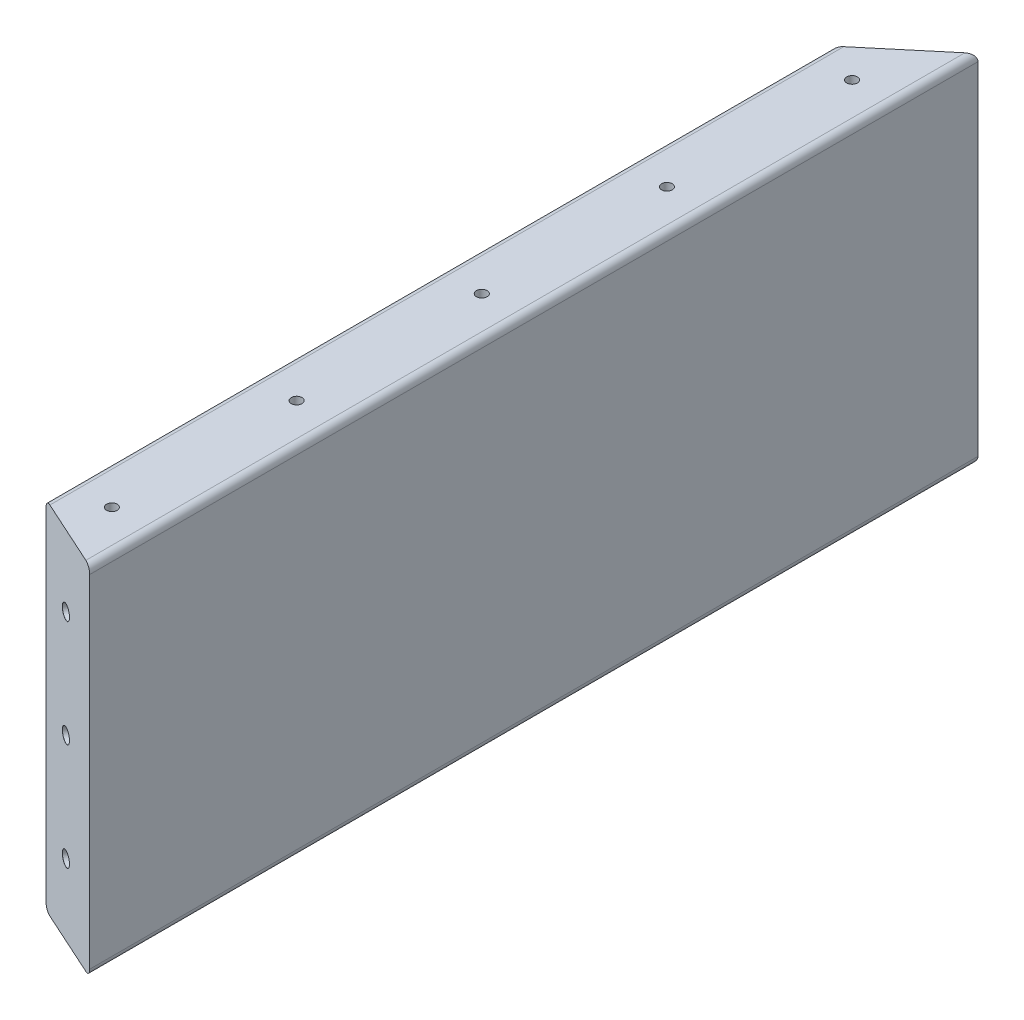
ISO-10303-21;
HEADER;
FILE_DESCRIPTION(('STEP AP214'),'2;1');
FILE_NAME('part.step','',(''),(''),'','','');
FILE_SCHEMA(('AUTOMOTIVE_DESIGN { 1 0 10303 214 1 1 1 1 }'));
ENDSEC;
DATA;
#1=APPLICATION_CONTEXT('core data for automotive mechanical design processes');
#2=APPLICATION_PROTOCOL_DEFINITION('international standard','automotive_design',2000,#1);
#3=PRODUCT_CONTEXT('',#1,'mechanical');
#4=PRODUCT('Part','Part','',(#3));
#5=PRODUCT_RELATED_PRODUCT_CATEGORY('part','',(#4));
#6=PRODUCT_DEFINITION_FORMATION('','',#4);
#7=PRODUCT_DEFINITION_CONTEXT('part definition',#1,'design');
#8=PRODUCT_DEFINITION('design','',#6,#7);
#9=PRODUCT_DEFINITION_SHAPE('','',#8);
#10=(LENGTH_UNIT() NAMED_UNIT(*) SI_UNIT(.MILLI.,.METRE.));
#11=(NAMED_UNIT(*) PLANE_ANGLE_UNIT() SI_UNIT($,.RADIAN.));
#12=(NAMED_UNIT(*) SI_UNIT($,.STERADIAN.) SOLID_ANGLE_UNIT());
#13=UNCERTAINTY_MEASURE_WITH_UNIT(LENGTH_MEASURE(1.E-05),#10,'distance_accuracy_value','');
#14=(GEOMETRIC_REPRESENTATION_CONTEXT(3) GLOBAL_UNCERTAINTY_ASSIGNED_CONTEXT((#13)) GLOBAL_UNIT_ASSIGNED_CONTEXT((#10,
#11,#12)) REPRESENTATION_CONTEXT('',''));
#15=CARTESIAN_POINT('',(0.,0.,0.));
#16=DIRECTION('',(0.,0.,1.));
#17=DIRECTION('',(1.,0.,0.));
#18=AXIS2_PLACEMENT_3D('',#15,#16,#17);
#19=CARTESIAN_POINT('',(13.8117445887715,134.272684877163,500.));
#20=DIRECTION('',(-1.,0.,0.));
#21=DIRECTION('',(0.,0.,1.));
#22=AXIS2_PLACEMENT_3D('',#19,#20,#21);
#23=PLANE('',#22);
#24=DIRECTION('',(0.,-1.,0.));
#25=VECTOR('',#24,1.);
#26=CARTESIAN_POINT('',(13.8117445887714,814.76440392337,1.02723667248411));
#27=LINE('',#26,#25);
#28=CARTESIAN_POINT('',(13.8117445887715,130.272684877163,1.02723667248412));
#29=VERTEX_POINT('',#28);
#30=CARTESIAN_POINT('',(13.8117445887715,-61.7273151228369,1.02723667248412));
#31=VERTEX_POINT('',#30);
#32=EDGE_CURVE('E233',#29,#31,#27,.T.);
#33=ORIENTED_EDGE('',*,*,#32,.F.);
#34=DIRECTION('',(0.,0.,-1.));
#35=VECTOR('',#34,1.);
#36=CARTESIAN_POINT('',(13.8117445887715,130.272684877163,500.));
#37=LINE('',#36,#35);
#38=CARTESIAN_POINT('',(13.8117445887715,130.272684877163,500.));
#39=VERTEX_POINT('',#38);
#40=EDGE_CURVE('E280',#29,#39,#37,.F.);
#41=ORIENTED_EDGE('',*,*,#40,.T.);
#42=DIRECTION('',(0.,1.,0.));
#43=VECTOR('',#42,1.);
#44=CARTESIAN_POINT('',(13.8117445887715,134.272684877163,500.));
#45=LINE('',#44,#43);
#46=CARTESIAN_POINT('',(13.8117445887715,-61.7273151228369,500.));
#47=VERTEX_POINT('',#46);
#48=EDGE_CURVE('E268',#47,#39,#45,.T.);
#49=ORIENTED_EDGE('',*,*,#48,.F.);
#50=DIRECTION('',(0.,0.,-1.));
#51=VECTOR('',#50,1.);
#52=CARTESIAN_POINT('',(13.8117445887715,-61.7273151228369,500.));
#53=LINE('',#52,#51);
#54=EDGE_CURVE('E282',#47,#31,#53,.T.);
#55=ORIENTED_EDGE('',*,*,#54,.T.);
#56=EDGE_LOOP('',(#33,#41,#49,#55));
#57=FACE_BOUND('',#56,.T.);
#58=ADVANCED_FACE('F32',(#57),#23,.F.);
#59=CARTESIAN_POINT('',(-31.1882554112285,134.272684877163,500.));
#60=DIRECTION('',(0.,-1.,0.));
#61=DIRECTION('',(0.,0.,-1.));
#62=AXIS2_PLACEMENT_3D('',#59,#60,#61);
#63=PLANE('',#62);
#64=CARTESIAN_POINT('',(-8.68825541122808,134.272684877163,49.2763141009438));
#65=DIRECTION('',(0.,-1.,0.));
#66=DIRECTION('',(0.,0.,-1.));
#67=AXIS2_PLACEMENT_3D('',#64,#65,#66);
#68=CIRCLE('',#67,2.99999999999999);
#69=CARTESIAN_POINT('',(-8.68825541122808,134.272684877163,46.2763141009438));
#70=VERTEX_POINT('',#69);
#71=EDGE_CURVE('E177',#70,#70,#68,.T.);
#72=ORIENTED_EDGE('',*,*,#71,.T.);
#73=EDGE_LOOP('',(#72));
#74=FACE_BOUND('',#73,.T.);
#75=CARTESIAN_POINT('',(-8.68825541122831,134.272684877163,465.074922814898));
#76=DIRECTION('',(0.,-1.,0.));
#77=DIRECTION('',(0.,0.,-1.));
#78=AXIS2_PLACEMENT_3D('',#75,#76,#77);
#79=CIRCLE('',#78,2.99999999999999);
#80=CARTESIAN_POINT('',(-8.68825541122831,134.272684877163,462.074922814898));
#81=VERTEX_POINT('',#80);
#82=EDGE_CURVE('E181',#81,#81,#79,.T.);
#83=ORIENTED_EDGE('',*,*,#82,.T.);
#84=EDGE_LOOP('',(#83));
#85=FACE_BOUND('',#84,.T.);
#86=CARTESIAN_POINT('',(-8.68825541122797,134.272684877163,153.276314100944));
#87=DIRECTION('',(0.,-1.,0.));
#88=DIRECTION('',(0.,0.,-1.));
#89=AXIS2_PLACEMENT_3D('',#86,#87,#88);
#90=CIRCLE('',#89,2.99999999999999);
#91=CARTESIAN_POINT('',(-8.68825541122797,134.272684877163,150.276314100944));
#92=VERTEX_POINT('',#91);
#93=EDGE_CURVE('E185',#92,#92,#90,.T.);
#94=ORIENTED_EDGE('',*,*,#93,.T.);
#95=EDGE_LOOP('',(#94));
#96=FACE_BOUND('',#95,.T.);
#97=CARTESIAN_POINT('',(-8.68825541122797,134.272684877163,257.276314100944));
#98=DIRECTION('',(0.,-1.,0.));
#99=DIRECTION('',(0.,0.,-1.));
#100=AXIS2_PLACEMENT_3D('',#97,#98,#99);
#101=CIRCLE('',#100,2.99999999999999);
#102=CARTESIAN_POINT('',(-8.68825541122797,134.272684877163,254.276314100944));
#103=VERTEX_POINT('',#102);
#104=EDGE_CURVE('E189',#103,#103,#101,.T.);
#105=ORIENTED_EDGE('',*,*,#104,.T.);
#106=EDGE_LOOP('',(#105));
#107=FACE_BOUND('',#106,.T.);
#108=CARTESIAN_POINT('',(-8.68825541122797,134.272684877163,361.276314100944));
#109=DIRECTION('',(0.,-1.,0.));
#110=DIRECTION('',(0.,0.,-1.));
#111=AXIS2_PLACEMENT_3D('',#108,#109,#110);
#112=CIRCLE('',#111,2.99999999999999);
#113=CARTESIAN_POINT('',(-8.68825541122797,134.272684877163,358.276314100944));
#114=VERTEX_POINT('',#113);
#115=EDGE_CURVE('E193',#114,#114,#112,.T.);
#116=ORIENTED_EDGE('',*,*,#115,.T.);
#117=EDGE_LOOP('',(#116));
#118=FACE_BOUND('',#117,.T.);
#119=DIRECTION('',(0.766068203582477,0.,-0.642759292005893));
#120=VECTOR('',#119,1.);
#121=CARTESIAN_POINT('',(-258.289896932573,134.272684877163,229.330483876858));
#122=LINE('',#121,#120);
#123=CARTESIAN_POINT('',(-27.1882554112286,134.272684877163,35.4277389371684));
#124=VERTEX_POINT('',#123);
#125=CARTESIAN_POINT('',(9.81174458877147,134.272684877163,4.38338323489235));
#126=VERTEX_POINT('',#125);
#127=EDGE_CURVE('E49',#124,#126,#122,.T.);
#128=ORIENTED_EDGE('',*,*,#127,.F.);
#129=DIRECTION('',(0.,0.,-1.));
#130=VECTOR('',#129,1.);
#131=CARTESIAN_POINT('',(-27.1882554112285,134.272684877163,500.));
#132=LINE('',#131,#130);
#133=CARTESIAN_POINT('',(-27.1882554112285,134.272684877163,481.386216801086));
#134=VERTEX_POINT('',#133);
#135=EDGE_CURVE('E41',#124,#134,#132,.F.);
#136=ORIENTED_EDGE('',*,*,#135,.T.);
#137=DIRECTION('',(0.910555296814359,0.,0.413387289890866));
#138=VECTOR('',#137,1.);
#139=CARTESIAN_POINT('',(-23.4982480962794,134.272684877163,483.061460609936));
#140=LINE('',#139,#138);
#141=CARTESIAN_POINT('',(9.81174458877147,134.272684877163,498.184021151325));
#142=VERTEX_POINT('',#141);
#143=EDGE_CURVE('E255',#134,#142,#140,.T.);
#144=ORIENTED_EDGE('',*,*,#143,.T.);
#145=DIRECTION('',(0.,0.,-1.));
#146=VECTOR('',#145,1.);
#147=CARTESIAN_POINT('',(9.81174458877147,134.272684877163,500.));
#148=LINE('',#147,#146);
#149=EDGE_CURVE('E285',#142,#126,#148,.T.);
#150=ORIENTED_EDGE('',*,*,#149,.T.);
#151=EDGE_LOOP('',(#128,#136,#144,#150));
#152=FACE_BOUND('',#151,.T.);
#153=ADVANCED_FACE('F333',(#74,#85,#96,#107,#118,#152),#63,.F.);
#154=CARTESIAN_POINT('',(-31.1882554112285,-65.7273151228369,500.));
#155=DIRECTION('',(0.,1.,0.));
#156=DIRECTION('',(0.,0.,1.));
#157=AXIS2_PLACEMENT_3D('',#154,#155,#156);
#158=PLANE('',#157);
#159=CARTESIAN_POINT('',(-8.68825541122786,-65.7273151228369,49.2763141009441));
#160=DIRECTION('',(0.,1.,0.));
#161=DIRECTION('',(0.,0.,1.));
#162=AXIS2_PLACEMENT_3D('',#159,#160,#161);
#163=CIRCLE('',#162,2.99999999999999);
#164=CARTESIAN_POINT('',(-8.68825541122786,-65.7273151228369,52.2763141009441));
#165=VERTEX_POINT('',#164);
#166=EDGE_CURVE('E36',#165,#165,#163,.T.);
#167=ORIENTED_EDGE('',*,*,#166,.T.);
#168=EDGE_LOOP('',(#167));
#169=FACE_BOUND('',#168,.T.);
#170=CARTESIAN_POINT('',(-8.68825541122808,-65.7273151228369,465.074922814898));
#171=DIRECTION('',(0.,1.,0.));
#172=DIRECTION('',(0.,0.,1.));
#173=AXIS2_PLACEMENT_3D('',#170,#171,#172);
#174=CIRCLE('',#173,2.99999999999999);
#175=CARTESIAN_POINT('',(-8.68825541122808,-65.7273151228369,468.074922814898));
#176=VERTEX_POINT('',#175);
#177=EDGE_CURVE('E161',#176,#176,#174,.T.);
#178=ORIENTED_EDGE('',*,*,#177,.T.);
#179=EDGE_LOOP('',(#178));
#180=FACE_BOUND('',#179,.T.);
#181=CARTESIAN_POINT('',(-8.68825541122775,-65.7273151228369,153.276314100944));
#182=DIRECTION('',(0.,1.,0.));
#183=DIRECTION('',(0.,0.,1.));
#184=AXIS2_PLACEMENT_3D('',#181,#182,#183);
#185=CIRCLE('',#184,2.99999999999999);
#186=CARTESIAN_POINT('',(-8.68825541122775,-65.7273151228369,156.276314100944));
#187=VERTEX_POINT('',#186);
#188=EDGE_CURVE('E165',#187,#187,#185,.T.);
#189=ORIENTED_EDGE('',*,*,#188,.T.);
#190=EDGE_LOOP('',(#189));
#191=FACE_BOUND('',#190,.T.);
#192=CARTESIAN_POINT('',(-8.68825541122775,-65.7273151228369,257.276314100944));
#193=DIRECTION('',(0.,1.,0.));
#194=DIRECTION('',(0.,0.,1.));
#195=AXIS2_PLACEMENT_3D('',#192,#193,#194);
#196=CIRCLE('',#195,2.99999999999999);
#197=CARTESIAN_POINT('',(-8.68825541122775,-65.7273151228369,260.276314100944));
#198=VERTEX_POINT('',#197);
#199=EDGE_CURVE('E169',#198,#198,#196,.T.);
#200=ORIENTED_EDGE('',*,*,#199,.T.);
#201=EDGE_LOOP('',(#200));
#202=FACE_BOUND('',#201,.T.);
#203=CARTESIAN_POINT('',(-8.68825541122775,-65.7273151228369,361.276314100944));
#204=DIRECTION('',(0.,1.,0.));
#205=DIRECTION('',(0.,0.,1.));
#206=AXIS2_PLACEMENT_3D('',#203,#204,#205);
#207=CIRCLE('',#206,2.99999999999999);
#208=CARTESIAN_POINT('',(-8.68825541122775,-65.7273151228369,364.276314100944));
#209=VERTEX_POINT('',#208);
#210=EDGE_CURVE('E173',#209,#209,#207,.T.);
#211=ORIENTED_EDGE('',*,*,#210,.T.);
#212=EDGE_LOOP('',(#211));
#213=FACE_BOUND('',#212,.T.);
#214=DIRECTION('',(-0.766068203582477,0.,0.642759292005893));
#215=VECTOR('',#214,1.);
#216=CARTESIAN_POINT('',(-258.289896932573,-65.7273151228369,229.330483876858));
#217=LINE('',#216,#215);
#218=CARTESIAN_POINT('',(9.81174458877147,-65.7273151228369,4.38338323489235));
#219=VERTEX_POINT('',#218);
#220=CARTESIAN_POINT('',(-27.1882554112285,-65.7273151228369,35.4277389371684));
#221=VERTEX_POINT('',#220);
#222=EDGE_CURVE('E244',#219,#221,#217,.T.);
#223=ORIENTED_EDGE('',*,*,#222,.F.);
#224=DIRECTION('',(0.,0.,-1.));
#225=VECTOR('',#224,1.);
#226=CARTESIAN_POINT('',(9.81174458877147,-65.7273151228369,500.));
#227=LINE('',#226,#225);
#228=CARTESIAN_POINT('',(9.81174458877147,-65.7273151228369,498.184021151325));
#229=VERTEX_POINT('',#228);
#230=EDGE_CURVE('E271',#219,#229,#227,.F.);
#231=ORIENTED_EDGE('',*,*,#230,.T.);
#232=DIRECTION('',(-0.910555296814359,0.,-0.413387289890866));
#233=VECTOR('',#232,1.);
#234=CARTESIAN_POINT('',(-23.4982480962793,-65.7273151228369,483.061460609936));
#235=LINE('',#234,#233);
#236=CARTESIAN_POINT('',(-27.1882554112285,-65.7273151228369,481.386216801086));
#237=VERTEX_POINT('',#236);
#238=EDGE_CURVE('E57',#229,#237,#235,.T.);
#239=ORIENTED_EDGE('',*,*,#238,.T.);
#240=DIRECTION('',(0.,0.,-1.));
#241=VECTOR('',#240,1.);
#242=CARTESIAN_POINT('',(-27.1882554112285,-65.7273151228369,500.));
#243=LINE('',#242,#241);
#244=EDGE_CURVE('E273',#237,#221,#243,.T.);
#245=ORIENTED_EDGE('',*,*,#244,.T.);
#246=EDGE_LOOP('',(#223,#231,#239,#245));
#247=FACE_BOUND('',#246,.T.);
#248=ADVANCED_FACE('F313',(#169,#180,#191,#202,#213,#247),#158,.F.);
#249=CARTESIAN_POINT('',(-27.1882554112285,-61.7273151228369,500.));
#250=DIRECTION('',(0.,0.,-1.));
#251=DIRECTION('',(-1.,0.,0.));
#252=AXIS2_PLACEMENT_3D('',#249,#250,#251);
#253=CYLINDRICAL_SURFACE('',#252,4.);
#254=DIRECTION('',(0.,0.,-1.));
#255=VECTOR('',#254,1.);
#256=CARTESIAN_POINT('',(-31.1882554112285,-61.7273151228369,500.));
#257=LINE('',#256,#255);
#258=CARTESIAN_POINT('',(-31.1882554112285,-61.7273151228369,38.7838854995766));
#259=VERTEX_POINT('',#258);
#260=CARTESIAN_POINT('',(-31.1882554112285,-61.7273151228369,479.570237952411));
#261=VERTEX_POINT('',#260);
#262=EDGE_CURVE('E278',#259,#261,#257,.F.);
#263=ORIENTED_EDGE('',*,*,#262,.F.);
#264=CARTESIAN_POINT('',(-27.1882554112285,-61.7273151228369,35.4277389371684));
#265=DIRECTION('',(-0.642759292005893,0.,-0.766068203582477));
#266=DIRECTION('',(0.766068203582477,0.,-0.642759292005893));
#267=AXIS2_PLACEMENT_3D('',#264,#265,#266);
#268=ELLIPSE('',#267,5.22146720265143,4.);
#269=EDGE_CURVE('E246',#259,#221,#268,.F.);
#270=ORIENTED_EDGE('',*,*,#269,.T.);
#271=ORIENTED_EDGE('',*,*,#244,.F.);
#272=CARTESIAN_POINT('',(-27.1882554112285,-61.7273151228369,481.386216801086));
#273=DIRECTION('',(0.413387289890866,0.,-0.910555296814359));
#274=DIRECTION('',(-0.910555296814359,0.,-0.413387289890866));
#275=AXIS2_PLACEMENT_3D('',#272,#273,#274);
#276=ELLIPSE('',#275,4.39292376201015,4.);
#277=EDGE_CURVE('E265',#261,#237,#276,.F.);
#278=ORIENTED_EDGE('',*,*,#277,.F.);
#279=EDGE_LOOP('',(#263,#270,#271,#278));
#280=FACE_BOUND('',#279,.T.);
#281=ADVANCED_FACE('F349',(#280),#253,.T.);
#282=CARTESIAN_POINT('',(9.81174458877148,-61.7273151228369,500.));
#283=DIRECTION('',(0.,0.,-1.));
#284=DIRECTION('',(-1.,0.,0.));
#285=AXIS2_PLACEMENT_3D('',#282,#283,#284);
#286=CYLINDRICAL_SURFACE('',#285,4.);
#287=ORIENTED_EDGE('',*,*,#230,.F.);
#288=CARTESIAN_POINT('',(9.81174458877148,-61.7273151228369,4.38338323489235));
#289=DIRECTION('',(-0.642759292005893,0.,-0.766068203582477));
#290=DIRECTION('',(0.766068203582477,0.,-0.642759292005893));
#291=AXIS2_PLACEMENT_3D('',#288,#289,#290);
#292=ELLIPSE('',#291,5.22146720265143,4.);
#293=EDGE_CURVE('E241',#219,#31,#292,.F.);
#294=ORIENTED_EDGE('',*,*,#293,.T.);
#295=ORIENTED_EDGE('',*,*,#54,.F.);
#296=CARTESIAN_POINT('',(9.81174458877148,-61.7273151228369,498.184021151325));
#297=DIRECTION('',(0.413387289890866,0.,-0.910555296814359));
#298=DIRECTION('',(-0.910555296814359,0.,-0.413387289890866));
#299=AXIS2_PLACEMENT_3D('',#296,#297,#298);
#300=ELLIPSE('',#299,4.39292376201015,4.);
#301=EDGE_CURVE('E261',#229,#47,#300,.F.);
#302=ORIENTED_EDGE('',*,*,#301,.F.);
#303=EDGE_LOOP('',(#287,#294,#295,#302));
#304=FACE_BOUND('',#303,.T.);
#305=ADVANCED_FACE('F357',(#304),#286,.T.);
#306=CARTESIAN_POINT('',(-27.1882554112285,130.272684877163,500.));
#307=DIRECTION('',(0.,0.,-1.));
#308=DIRECTION('',(-1.,0.,0.));
#309=AXIS2_PLACEMENT_3D('',#306,#307,#308);
#310=CYLINDRICAL_SURFACE('',#309,4.);
#311=ORIENTED_EDGE('',*,*,#135,.F.);
#312=CARTESIAN_POINT('',(-27.1882554112285,130.272684877163,35.4277389371684));
#313=DIRECTION('',(-0.642759292005893,0.,-0.766068203582477));
#314=DIRECTION('',(0.766068203582477,0.,-0.642759292005893));
#315=AXIS2_PLACEMENT_3D('',#312,#313,#314);
#316=ELLIPSE('',#315,5.22146720265143,4.);
#317=CARTESIAN_POINT('',(-31.1882554112285,130.272684877163,38.7838854995766));
#318=VERTEX_POINT('',#317);
#319=EDGE_CURVE('E238',#124,#318,#316,.F.);
#320=ORIENTED_EDGE('',*,*,#319,.T.);
#321=DIRECTION('',(0.,0.,-1.));
#322=VECTOR('',#321,1.);
#323=CARTESIAN_POINT('',(-31.1882554112285,130.272684877163,500.));
#324=LINE('',#323,#322);
#325=CARTESIAN_POINT('',(-31.1882554112285,130.272684877163,479.570237952411));
#326=VERTEX_POINT('',#325);
#327=EDGE_CURVE('E275',#326,#318,#324,.T.);
#328=ORIENTED_EDGE('',*,*,#327,.F.);
#329=CARTESIAN_POINT('',(-27.1882554112285,130.272684877163,481.386216801086));
#330=DIRECTION('',(0.413387289890866,0.,-0.910555296814359));
#331=DIRECTION('',(-0.910555296814359,0.,-0.413387289890866));
#332=AXIS2_PLACEMENT_3D('',#329,#330,#331);
#333=ELLIPSE('',#332,4.39292376201015,4.);
#334=EDGE_CURVE('E258',#134,#326,#333,.F.);
#335=ORIENTED_EDGE('',*,*,#334,.F.);
#336=EDGE_LOOP('',(#311,#320,#328,#335));
#337=FACE_BOUND('',#336,.T.);
#338=ADVANCED_FACE('F360',(#337),#310,.T.);
#339=CARTESIAN_POINT('',(9.81174458877147,130.272684877163,500.));
#340=DIRECTION('',(0.,0.,-1.));
#341=DIRECTION('',(-1.,0.,0.));
#342=AXIS2_PLACEMENT_3D('',#339,#340,#341);
#343=CYLINDRICAL_SURFACE('',#342,4.);
#344=ORIENTED_EDGE('',*,*,#40,.F.);
#345=CARTESIAN_POINT('',(9.81174458877147,130.272684877163,4.38338323489235));
#346=DIRECTION('',(-0.642759292005893,0.,-0.766068203582477));
#347=DIRECTION('',(0.766068203582477,0.,-0.642759292005893));
#348=AXIS2_PLACEMENT_3D('',#345,#346,#347);
#349=ELLIPSE('',#348,5.22146720265143,4.);
#350=EDGE_CURVE('E235',#29,#126,#349,.F.);
#351=ORIENTED_EDGE('',*,*,#350,.T.);
#352=ORIENTED_EDGE('',*,*,#149,.F.);
#353=CARTESIAN_POINT('',(9.81174458877147,130.272684877163,498.184021151325));
#354=DIRECTION('',(0.413387289890866,0.,-0.910555296814359));
#355=DIRECTION('',(-0.910555296814359,0.,-0.413387289890866));
#356=AXIS2_PLACEMENT_3D('',#353,#354,#355);
#357=ELLIPSE('',#356,4.39292376201015,4.);
#358=EDGE_CURVE('E11',#39,#142,#357,.F.);
#359=ORIENTED_EDGE('',*,*,#358,.F.);
#360=EDGE_LOOP('',(#344,#351,#352,#359));
#361=FACE_BOUND('',#360,.T.);
#362=ADVANCED_FACE('F34',(#361),#343,.T.);
#363=CARTESIAN_POINT('',(-31.1882554112285,134.272684877163,500.));
#364=DIRECTION('',(1.,0.,0.));
#365=DIRECTION('',(0.,1.,0.));
#366=AXIS2_PLACEMENT_3D('',#363,#364,#365);
#367=PLANE('',#366);
#368=ORIENTED_EDGE('',*,*,#327,.T.);
#369=DIRECTION('',(0.,-1.,0.));
#370=VECTOR('',#369,1.);
#371=CARTESIAN_POINT('',(-31.1882554112285,814.76440392337,38.7838854995766));
#372=LINE('',#371,#370);
#373=EDGE_CURVE('E249',#318,#259,#372,.T.);
#374=ORIENTED_EDGE('',*,*,#373,.T.);
#375=ORIENTED_EDGE('',*,*,#262,.T.);
#376=DIRECTION('',(0.,-1.,0.));
#377=VECTOR('',#376,1.);
#378=CARTESIAN_POINT('',(-31.1882554112285,809.76440392337,479.570237952411));
#379=LINE('',#378,#377);
#380=EDGE_CURVE('E252',#326,#261,#379,.T.);
#381=ORIENTED_EDGE('',*,*,#380,.F.);
#382=EDGE_LOOP('',(#368,#374,#375,#381));
#383=FACE_BOUND('',#382,.T.);
#384=ADVANCED_FACE('F351',(#383),#367,.F.);
#385=CARTESIAN_POINT('',(-31.1882554112285,809.76440392337,479.570237952411));
#386=DIRECTION('',(0.413387289890866,0.,-0.910555296814359));
#387=DIRECTION('',(-0.910555296814359,0.,-0.413387289890866));
#388=AXIS2_PLACEMENT_3D('',#385,#386,#387);
#389=PLANE('',#388);
#390=CARTESIAN_POINT('',(-10.7007612329055,94.2726848771631,488.871451974956));
#391=DIRECTION('',(-0.413387289890866,0.,0.910555296814359));
#392=DIRECTION('',(0.910555296814359,0.,0.413387289890866));
#393=AXIS2_PLACEMENT_3D('',#390,#391,#392);
#394=CIRCLE('',#393,4.025);
#395=CARTESIAN_POINT('',(-7.03577616322771,94.2726848771631,490.535335816766));
#396=VERTEX_POINT('',#395);
#397=EDGE_CURVE('E194',#396,#396,#394,.T.);
#398=ORIENTED_EDGE('',*,*,#397,.F.);
#399=EDGE_LOOP('',(#398));
#400=FACE_BOUND('',#399,.T.);
#401=CARTESIAN_POINT('',(-10.7007612329055,34.2726848771631,488.871451974956));
#402=DIRECTION('',(-0.413387289890866,0.,0.910555296814359));
#403=DIRECTION('',(0.910555296814359,0.,0.413387289890866));
#404=AXIS2_PLACEMENT_3D('',#401,#402,#403);
#405=CIRCLE('',#404,4.025);
#406=CARTESIAN_POINT('',(-7.03577616322771,34.2726848771631,490.535335816766));
#407=VERTEX_POINT('',#406);
#408=EDGE_CURVE('E203',#407,#407,#405,.T.);
#409=ORIENTED_EDGE('',*,*,#408,.F.);
#410=EDGE_LOOP('',(#409));
#411=FACE_BOUND('',#410,.T.);
#412=CARTESIAN_POINT('',(-10.7007612329055,-25.7273151228369,488.871451974956));
#413=DIRECTION('',(-0.413387289890866,0.,0.910555296814359));
#414=DIRECTION('',(0.910555296814359,0.,0.413387289890866));
#415=AXIS2_PLACEMENT_3D('',#412,#413,#414);
#416=CIRCLE('',#415,4.025);
#417=CARTESIAN_POINT('',(-7.03577616322771,-25.7273151228369,490.535335816766));
#418=VERTEX_POINT('',#417);
#419=EDGE_CURVE('E212',#418,#418,#416,.T.);
#420=ORIENTED_EDGE('',*,*,#419,.F.);
#421=EDGE_LOOP('',(#420));
#422=FACE_BOUND('',#421,.T.);
#423=ORIENTED_EDGE('',*,*,#380,.T.);
#424=ORIENTED_EDGE('',*,*,#277,.T.);
#425=ORIENTED_EDGE('',*,*,#238,.F.);
#426=ORIENTED_EDGE('',*,*,#301,.T.);
#427=ORIENTED_EDGE('',*,*,#48,.T.);
#428=ORIENTED_EDGE('',*,*,#358,.T.);
#429=ORIENTED_EDGE('',*,*,#143,.F.);
#430=ORIENTED_EDGE('',*,*,#334,.T.);
#431=EDGE_LOOP('',(#423,#424,#425,#426,#427,#428,#429,#430));
#432=FACE_BOUND('',#431,.T.);
#433=ADVANCED_FACE('F345',(#400,#411,#422,#432),#389,.F.);
#434=CARTESIAN_POINT('',(-31.1882554112285,814.76440392337,38.7838854995766));
#435=DIRECTION('',(-0.642759292005893,0.,-0.766068203582477));
#436=DIRECTION('',(-0.766068203582477,0.,0.642759292005893));
#437=AXIS2_PLACEMENT_3D('',#434,#435,#436);
#438=PLANE('',#437);
#439=CARTESIAN_POINT('',(-8.52255726556561,-25.7273151228489,19.7665342705393));
#440=DIRECTION('',(-0.642759292005893,0.,-0.766068203582477));
#441=DIRECTION('',(0.766068203582477,0.,-0.642759292005893));
#442=AXIS2_PLACEMENT_3D('',#439,#440,#441);
#443=ELLIPSE('',#442,3.91584152565515,2.99999999999999);
#444=CARTESIAN_POINT('',(-5.5227555824933,-25.7273151228489,17.249590743902));
#445=VERTEX_POINT('',#444);
#446=EDGE_CURVE('E224',#445,#445,#443,.T.);
#447=ORIENTED_EDGE('',*,*,#446,.F.);
#448=EDGE_LOOP('',(#447));
#449=FACE_BOUND('',#448,.T.);
#450=CARTESIAN_POINT('',(-8.52255726556561,34.2726848771511,19.7665342705394));
#451=DIRECTION('',(-0.642759292005893,0.,-0.766068203582477));
#452=DIRECTION('',(0.766068203582477,0.,-0.642759292005893));
#453=AXIS2_PLACEMENT_3D('',#450,#451,#452);
#454=ELLIPSE('',#453,3.91584152565515,2.99999999999999);
#455=CARTESIAN_POINT('',(-5.5227555824933,34.2726848771511,17.249590743902));
#456=VERTEX_POINT('',#455);
#457=EDGE_CURVE('E228',#456,#456,#454,.T.);
#458=ORIENTED_EDGE('',*,*,#457,.F.);
#459=EDGE_LOOP('',(#458));
#460=FACE_BOUND('',#459,.T.);
#461=CARTESIAN_POINT('',(-8.52255726556561,94.2726848771511,19.7665342705393));
#462=DIRECTION('',(-0.642759292005893,0.,-0.766068203582477));
#463=DIRECTION('',(0.766068203582477,0.,-0.642759292005893));
#464=AXIS2_PLACEMENT_3D('',#461,#462,#463);
#465=ELLIPSE('',#464,3.91584152565515,2.99999999999998);
#466=CARTESIAN_POINT('',(-5.5227555824933,94.2726848771511,17.249590743902));
#467=VERTEX_POINT('',#466);
#468=EDGE_CURVE('E232',#467,#467,#465,.T.);
#469=ORIENTED_EDGE('',*,*,#468,.F.);
#470=EDGE_LOOP('',(#469));
#471=FACE_BOUND('',#470,.T.);
#472=ORIENTED_EDGE('',*,*,#269,.F.);
#473=ORIENTED_EDGE('',*,*,#373,.F.);
#474=ORIENTED_EDGE('',*,*,#319,.F.);
#475=ORIENTED_EDGE('',*,*,#127,.T.);
#476=ORIENTED_EDGE('',*,*,#350,.F.);
#477=ORIENTED_EDGE('',*,*,#32,.T.);
#478=ORIENTED_EDGE('',*,*,#293,.F.);
#479=ORIENTED_EDGE('',*,*,#222,.T.);
#480=EDGE_LOOP('',(#472,#473,#474,#475,#476,#477,#478,#479));
#481=FACE_BOUND('',#480,.T.);
#482=ADVANCED_FACE('F375',(#449,#460,#471,#481),#438,.T.);
#483=CARTESIAN_POINT('',(-8.51923368004279,94.2726848771511,61.9459101549118));
#484=DIRECTION('',(-7.87964601849687E-05,0.,-0.999999996895559));
#485=DIRECTION('',(-0.999999996895559,0.,7.87964601849687E-05));
#486=AXIS2_PLACEMENT_3D('',#483,#484,#485);
#487=CONICAL_SURFACE('',#486,2.99999999999998,1.02974425867663);
#488=CARTESIAN_POINT('',(-8.51909164297326,94.2726848771511,63.7484920063984));
#489=VERTEX_POINT('',#488);
#490=VERTEX_LOOP('',#489);
#491=FACE_BOUND('',#490,.T.);
#492=CARTESIAN_POINT('',(-8.51923368004279,94.2726848771511,61.9459101549118));
#493=DIRECTION('',(-7.87964601849687E-05,0.,-0.999999996895559));
#494=DIRECTION('',(-0.999999996895559,0.,7.87964601849687E-05));
#495=AXIS2_PLACEMENT_3D('',#492,#493,#494);
#496=CIRCLE('',#495,2.99999999999998);
#497=CARTESIAN_POINT('',(-11.5192336707294,94.2726848771511,61.9461465442923));
#498=VERTEX_POINT('',#497);
#499=EDGE_CURVE('E229',#498,#498,#496,.T.);
#500=ORIENTED_EDGE('',*,*,#499,.T.);
#501=EDGE_LOOP('',(#500));
#502=FACE_BOUND('',#501,.T.);
#503=ADVANCED_FACE('F390',(#491,#502),#487,.F.);
#504=CARTESIAN_POINT('',(-8.5293351827973,94.2726848771511,-66.2515075900242));
#505=DIRECTION('',(-7.87964601849687E-05,0.,-0.999999996895559));
#506=DIRECTION('',(-0.999999996895559,0.,7.87964601849687E-05));
#507=AXIS2_PLACEMENT_3D('',#504,#505,#506);
#508=CYLINDRICAL_SURFACE('',#507,2.99999999999998);
#509=ORIENTED_EDGE('',*,*,#468,.T.);
#510=EDGE_LOOP('',(#509));
#511=FACE_BOUND('',#510,.T.);
#512=ORIENTED_EDGE('',*,*,#499,.F.);
#513=EDGE_LOOP('',(#512));
#514=FACE_BOUND('',#513,.T.);
#515=ADVANCED_FACE('F435',(#511,#514),#508,.F.);
#516=CARTESIAN_POINT('',(-8.51923368004279,34.2726848771511,61.9459101549124));
#517=DIRECTION('',(-7.87964601849687E-05,0.,-0.999999996895559));
#518=DIRECTION('',(-0.999999996895559,0.,7.87964601849687E-05));
#519=AXIS2_PLACEMENT_3D('',#516,#517,#518);
#520=CONICAL_SURFACE('',#519,2.99999999999998,1.02974425867663);
#521=CARTESIAN_POINT('',(-8.51909164297326,34.2726848771511,63.748492006399));
#522=VERTEX_POINT('',#521);
#523=VERTEX_LOOP('',#522);
#524=FACE_BOUND('',#523,.T.);
#525=CARTESIAN_POINT('',(-8.51923368004279,34.2726848771511,61.9459101549124));
#526=DIRECTION('',(-7.87964601849687E-05,0.,-0.999999996895559));
#527=DIRECTION('',(-0.999999996895559,0.,7.87964601849687E-05));
#528=AXIS2_PLACEMENT_3D('',#525,#526,#527);
#529=CIRCLE('',#528,2.99999999999998);
#530=CARTESIAN_POINT('',(-11.5192336707295,34.2726848771511,61.9461465442929));
#531=VERTEX_POINT('',#530);
#532=EDGE_CURVE('E225',#531,#531,#529,.T.);
#533=ORIENTED_EDGE('',*,*,#532,.T.);
#534=EDGE_LOOP('',(#533));
#535=FACE_BOUND('',#534,.T.);
#536=ADVANCED_FACE('F431',(#524,#535),#520,.F.);
#537=CARTESIAN_POINT('',(-8.5293351827973,34.2726848771511,-66.2515075900236));
#538=DIRECTION('',(-7.87964601849687E-05,0.,-0.999999996895559));
#539=DIRECTION('',(-0.999999996895559,0.,7.87964601849687E-05));
#540=AXIS2_PLACEMENT_3D('',#537,#538,#539);
#541=CYLINDRICAL_SURFACE('',#540,2.99999999999999);
#542=ORIENTED_EDGE('',*,*,#457,.T.);
#543=EDGE_LOOP('',(#542));
#544=FACE_BOUND('',#543,.T.);
#545=ORIENTED_EDGE('',*,*,#532,.F.);
#546=EDGE_LOOP('',(#545));
#547=FACE_BOUND('',#546,.T.);
#548=ADVANCED_FACE('F427',(#544,#547),#541,.F.);
#549=CARTESIAN_POINT('',(-8.51923368004279,-25.7273151228489,61.945910154913));
#550=DIRECTION('',(-7.87964601849687E-05,0.,-0.999999996895559));
#551=DIRECTION('',(-0.999999996895559,0.,7.87964601849687E-05));
#552=AXIS2_PLACEMENT_3D('',#549,#550,#551);
#553=CONICAL_SURFACE('',#552,2.99999999999998,1.02974425867663);
#554=CARTESIAN_POINT('',(-8.51909164297326,-25.7273151228489,63.7484920063996));
#555=VERTEX_POINT('',#554);
#556=VERTEX_LOOP('',#555);
#557=FACE_BOUND('',#556,.T.);
#558=CARTESIAN_POINT('',(-8.51923368004279,-25.7273151228489,61.945910154913));
#559=DIRECTION('',(-7.87964601849687E-05,0.,-0.999999996895559));
#560=DIRECTION('',(-0.999999996895559,0.,7.87964601849687E-05));
#561=AXIS2_PLACEMENT_3D('',#558,#559,#560);
#562=CIRCLE('',#561,2.99999999999998);
#563=CARTESIAN_POINT('',(-11.5192336707295,-25.7273151228489,61.9461465442935));
#564=VERTEX_POINT('',#563);
#565=EDGE_CURVE('E221',#564,#564,#562,.T.);
#566=ORIENTED_EDGE('',*,*,#565,.T.);
#567=EDGE_LOOP('',(#566));
#568=FACE_BOUND('',#567,.T.);
#569=ADVANCED_FACE('F423',(#557,#568),#553,.F.);
#570=CARTESIAN_POINT('',(-8.5293351827973,-25.7273151228489,-66.2515075900231));
#571=DIRECTION('',(-7.87964601849687E-05,0.,-0.999999996895559));
#572=DIRECTION('',(-0.999999996895559,0.,7.87964601849687E-05));
#573=AXIS2_PLACEMENT_3D('',#570,#571,#572);
#574=CYLINDRICAL_SURFACE('',#573,2.99999999999999);
#575=ORIENTED_EDGE('',*,*,#446,.T.);
#576=EDGE_LOOP('',(#575));
#577=FACE_BOUND('',#576,.T.);
#578=ORIENTED_EDGE('',*,*,#565,.F.);
#579=EDGE_LOOP('',(#578));
#580=FACE_BOUND('',#579,.T.);
#581=ADVANCED_FACE('F419',(#577,#580),#574,.F.);
#582=CARTESIAN_POINT('',(-1.35963155724166,-25.7273151228369,468.296036831808));
#583=DIRECTION('',(-0.413387289890866,0.,0.910555296814359));
#584=DIRECTION('',(0.910555296814359,0.,0.413387289890866));
#585=AXIS2_PLACEMENT_3D('',#582,#583,#584);
#586=CONICAL_SURFACE('',#585,3.99999999999999,1.02974425867665);
#587=CARTESIAN_POINT('',(-0.366078985633846,-25.7273151228369,466.107569554597));
#588=VERTEX_POINT('',#587);
#589=VERTEX_LOOP('',#588);
#590=FACE_BOUND('',#589,.T.);
#591=CARTESIAN_POINT('',(-1.35963155724166,-25.7273151228369,468.296036831808));
#592=DIRECTION('',(-0.413387289890866,0.,0.910555296814359));
#593=DIRECTION('',(0.910555296814359,0.,0.413387289890866));
#594=AXIS2_PLACEMENT_3D('',#591,#592,#593);
#595=CIRCLE('',#594,3.99999999999999);
#596=CARTESIAN_POINT('',(2.28258963001577,-25.7273151228369,469.949585991371));
#597=VERTEX_POINT('',#596);
#598=EDGE_CURVE('E218',#597,#597,#595,.T.);
#599=ORIENTED_EDGE('',*,*,#598,.T.);
#600=EDGE_LOOP('',(#599));
#601=FACE_BOUND('',#600,.T.);
#602=ADVANCED_FACE('F411',(#590,#601),#586,.F.);
#603=CARTESIAN_POINT('',(-10.7007612329055,-25.7273151228369,488.871451974956));
#604=DIRECTION('',(-0.413387289890866,0.,0.910555296814359));
#605=DIRECTION('',(0.910555296814359,0.,0.413387289890866));
#606=AXIS2_PLACEMENT_3D('',#603,#604,#605);
#607=CYLINDRICAL_SURFACE('',#606,3.99999999999999);
#608=ORIENTED_EDGE('',*,*,#598,.F.);
#609=EDGE_LOOP('',(#608));
#610=FACE_BOUND('',#609,.T.);
#611=CARTESIAN_POINT('',(-10.6904265506582,-25.7273151228369,488.848688092535));
#612=DIRECTION('',(-0.413387289890866,0.,0.910555296814359));
#613=DIRECTION('',(0.910555296814359,0.,0.413387289890866));
#614=AXIS2_PLACEMENT_3D('',#611,#612,#613);
#615=CIRCLE('',#614,3.99999999999999);
#616=CARTESIAN_POINT('',(-7.04820536340079,-25.7273151228369,490.502237252099));
#617=VERTEX_POINT('',#616);
#618=EDGE_CURVE('E215',#617,#617,#615,.T.);
#619=ORIENTED_EDGE('',*,*,#618,.T.);
#620=EDGE_LOOP('',(#619));
#621=FACE_BOUND('',#620,.T.);
#622=ADVANCED_FACE('F401',(#610,#621),#607,.F.);
#623=CARTESIAN_POINT('',(-10.7007612329055,-25.7273151228369,488.871451974956));
#624=DIRECTION('',(-0.413387289890866,0.,0.910555296814359));
#625=DIRECTION('',(0.910555296814359,0.,0.413387289890866));
#626=AXIS2_PLACEMENT_3D('',#623,#624,#625);
#627=CONICAL_SURFACE('',#626,4.025,0.785398163396873);
#628=ORIENTED_EDGE('',*,*,#618,.F.);
#629=EDGE_LOOP('',(#628));
#630=FACE_BOUND('',#629,.T.);
#631=ORIENTED_EDGE('',*,*,#419,.T.);
#632=EDGE_LOOP('',(#631));
#633=FACE_BOUND('',#632,.T.);
#634=ADVANCED_FACE('F398',(#630,#633),#627,.F.);
#635=CARTESIAN_POINT('',(-1.35963155724166,34.2726848771631,468.296036831808));
#636=DIRECTION('',(-0.413387289890866,0.,0.910555296814359));
#637=DIRECTION('',(0.910555296814359,0.,0.413387289890866));
#638=AXIS2_PLACEMENT_3D('',#635,#636,#637);
#639=CONICAL_SURFACE('',#638,4.,1.02974425867665);
#640=CARTESIAN_POINT('',(-0.366078985633846,34.2726848771631,466.107569554597));
#641=VERTEX_POINT('',#640);
#642=VERTEX_LOOP('',#641);
#643=FACE_BOUND('',#642,.T.);
#644=CARTESIAN_POINT('',(-1.35963155724166,34.2726848771631,468.296036831808));
#645=DIRECTION('',(-0.413387289890866,0.,0.910555296814359));
#646=DIRECTION('',(0.910555296814359,0.,0.413387289890866));
#647=AXIS2_PLACEMENT_3D('',#644,#645,#646);
#648=CIRCLE('',#647,4.);
#649=CARTESIAN_POINT('',(2.28258963001577,34.2726848771631,469.949585991371));
#650=VERTEX_POINT('',#649);
#651=EDGE_CURVE('E209',#650,#650,#648,.T.);
#652=ORIENTED_EDGE('',*,*,#651,.T.);
#653=EDGE_LOOP('',(#652));
#654=FACE_BOUND('',#653,.T.);
#655=ADVANCED_FACE('F400',(#643,#654),#639,.F.);
#656=CARTESIAN_POINT('',(-10.7007612329055,34.2726848771631,488.871451974956));
#657=DIRECTION('',(-0.413387289890866,0.,0.910555296814359));
#658=DIRECTION('',(0.910555296814359,0.,0.413387289890866));
#659=AXIS2_PLACEMENT_3D('',#656,#657,#658);
#660=CYLINDRICAL_SURFACE('',#659,3.99999999999999);
#661=ORIENTED_EDGE('',*,*,#651,.F.);
#662=EDGE_LOOP('',(#661));
#663=FACE_BOUND('',#662,.T.);
#664=CARTESIAN_POINT('',(-10.6904265506582,34.2726848771631,488.848688092535));
#665=DIRECTION('',(-0.413387289890866,0.,0.910555296814359));
#666=DIRECTION('',(0.910555296814359,0.,0.413387289890866));
#667=AXIS2_PLACEMENT_3D('',#664,#665,#666);
#668=CIRCLE('',#667,3.99999999999999);
#669=CARTESIAN_POINT('',(-7.04820536340079,34.2726848771631,490.502237252099));
#670=VERTEX_POINT('',#669);
#671=EDGE_CURVE('E206',#670,#670,#668,.T.);
#672=ORIENTED_EDGE('',*,*,#671,.T.);
#673=EDGE_LOOP('',(#672));
#674=FACE_BOUND('',#673,.T.);
#675=ADVANCED_FACE('F408',(#663,#674),#660,.F.);
#676=CARTESIAN_POINT('',(-10.7007612329055,34.2726848771631,488.871451974956));
#677=DIRECTION('',(-0.413387289890866,0.,0.910555296814359));
#678=DIRECTION('',(0.910555296814359,0.,0.413387289890866));
#679=AXIS2_PLACEMENT_3D('',#676,#677,#678);
#680=CONICAL_SURFACE('',#679,4.025,0.785398163396873);
#681=ORIENTED_EDGE('',*,*,#671,.F.);
#682=EDGE_LOOP('',(#681));
#683=FACE_BOUND('',#682,.T.);
#684=ORIENTED_EDGE('',*,*,#408,.T.);
#685=EDGE_LOOP('',(#684));
#686=FACE_BOUND('',#685,.T.);
#687=ADVANCED_FACE('F495',(#683,#686),#680,.F.);
#688=CARTESIAN_POINT('',(-1.35963155724166,94.2726848771631,468.296036831808));
#689=DIRECTION('',(-0.413387289890866,0.,0.910555296814359));
#690=DIRECTION('',(0.910555296814359,0.,0.413387289890866));
#691=AXIS2_PLACEMENT_3D('',#688,#689,#690);
#692=CONICAL_SURFACE('',#691,3.99999999999999,1.02974425867665);
#693=CARTESIAN_POINT('',(-0.366078985633846,94.2726848771631,466.107569554597));
#694=VERTEX_POINT('',#693);
#695=VERTEX_LOOP('',#694);
#696=FACE_BOUND('',#695,.T.);
#697=CARTESIAN_POINT('',(-1.35963155724166,94.2726848771631,468.296036831808));
#698=DIRECTION('',(-0.413387289890866,0.,0.910555296814359));
#699=DIRECTION('',(0.910555296814359,0.,0.413387289890866));
#700=AXIS2_PLACEMENT_3D('',#697,#698,#699);
#701=CIRCLE('',#700,3.99999999999999);
#702=CARTESIAN_POINT('',(2.28258963001576,94.2726848771631,469.949585991371));
#703=VERTEX_POINT('',#702);
#704=EDGE_CURVE('E200',#703,#703,#701,.T.);
#705=ORIENTED_EDGE('',*,*,#704,.T.);
#706=EDGE_LOOP('',(#705));
#707=FACE_BOUND('',#706,.T.);
#708=ADVANCED_FACE('F504',(#696,#707),#692,.F.);
#709=CARTESIAN_POINT('',(-10.7007612329055,94.2726848771631,488.871451974956));
#710=DIRECTION('',(-0.413387289890866,0.,0.910555296814359));
#711=DIRECTION('',(0.910555296814359,0.,0.413387289890866));
#712=AXIS2_PLACEMENT_3D('',#709,#710,#711);
#713=CYLINDRICAL_SURFACE('',#712,3.99999999999999);
#714=ORIENTED_EDGE('',*,*,#704,.F.);
#715=EDGE_LOOP('',(#714));
#716=FACE_BOUND('',#715,.T.);
#717=CARTESIAN_POINT('',(-10.6904265506582,94.2726848771631,488.848688092535));
#718=DIRECTION('',(-0.413387289890866,0.,0.910555296814359));
#719=DIRECTION('',(0.910555296814359,0.,0.413387289890866));
#720=AXIS2_PLACEMENT_3D('',#717,#718,#719);
#721=CIRCLE('',#720,3.99999999999999);
#722=CARTESIAN_POINT('',(-7.04820536340079,94.2726848771631,490.502237252099));
#723=VERTEX_POINT('',#722);
#724=EDGE_CURVE('E197',#723,#723,#721,.T.);
#725=ORIENTED_EDGE('',*,*,#724,.T.);
#726=EDGE_LOOP('',(#725));
#727=FACE_BOUND('',#726,.T.);
#728=ADVANCED_FACE('F514',(#716,#727),#713,.F.);
#729=CARTESIAN_POINT('',(-10.7007612329055,94.2726848771631,488.871451974956));
#730=DIRECTION('',(-0.413387289890866,0.,0.910555296814359));
#731=DIRECTION('',(0.910555296814359,0.,0.413387289890866));
#732=AXIS2_PLACEMENT_3D('',#729,#730,#731);
#733=CONICAL_SURFACE('',#732,4.025,0.785398163396873);
#734=ORIENTED_EDGE('',*,*,#724,.F.);
#735=EDGE_LOOP('',(#734));
#736=FACE_BOUND('',#735,.T.);
#737=ORIENTED_EDGE('',*,*,#397,.T.);
#738=EDGE_LOOP('',(#737));
#739=FACE_BOUND('',#738,.T.);
#740=ADVANCED_FACE('F524',(#736,#739),#733,.F.);
#741=CARTESIAN_POINT('',(-8.68825541122797,146.27268487716,361.276314100944));
#742=DIRECTION('',(0.,1.,0.));
#743=DIRECTION('',(0.,0.,1.));
#744=AXIS2_PLACEMENT_3D('',#741,#742,#743);
#745=CYLINDRICAL_SURFACE('',#744,2.99999999999999);
#746=CARTESIAN_POINT('',(-8.68825541122797,118.075266734242,361.276314100944));
#747=DIRECTION('',(0.,1.,0.));
#748=DIRECTION('',(0.,0.,1.));
#749=AXIS2_PLACEMENT_3D('',#746,#747,#748);
#750=CIRCLE('',#749,2.99999999999999);
#751=CARTESIAN_POINT('',(-8.68825541122797,118.075266734242,364.276314100944));
#752=VERTEX_POINT('',#751);
#753=EDGE_CURVE('E190',#752,#752,#750,.T.);
#754=ORIENTED_EDGE('',*,*,#753,.F.);
#755=EDGE_LOOP('',(#754));
#756=FACE_BOUND('',#755,.T.);
#757=ORIENTED_EDGE('',*,*,#115,.F.);
#758=EDGE_LOOP('',(#757));
#759=FACE_BOUND('',#758,.T.);
#760=ADVANCED_FACE('F533',(#756,#759),#745,.F.);
#761=CARTESIAN_POINT('',(-8.68825541122797,118.075266734242,361.276314100944));
#762=DIRECTION('',(0.,1.,0.));
#763=DIRECTION('',(0.,0.,1.));
#764=AXIS2_PLACEMENT_3D('',#761,#762,#763);
#765=CONICAL_SURFACE('',#764,2.99999999999999,1.02974425867665);
#766=CARTESIAN_POINT('',(-8.68825541122798,116.27268487716,361.276314100944));
#767=VERTEX_POINT('',#766);
#768=VERTEX_LOOP('',#767);
#769=FACE_BOUND('',#768,.T.);
#770=ORIENTED_EDGE('',*,*,#753,.T.);
#771=EDGE_LOOP('',(#770));
#772=FACE_BOUND('',#771,.T.);
#773=ADVANCED_FACE('F548',(#769,#772),#765,.F.);
#774=CARTESIAN_POINT('',(-8.68825541122797,146.272684877159,257.276314100944));
#775=DIRECTION('',(0.,1.,0.));
#776=DIRECTION('',(0.,0.,1.));
#777=AXIS2_PLACEMENT_3D('',#774,#775,#776);
#778=CYLINDRICAL_SURFACE('',#777,2.99999999999999);
#779=CARTESIAN_POINT('',(-8.68825541122797,118.075266734242,257.276314100944));
#780=DIRECTION('',(0.,1.,0.));
#781=DIRECTION('',(0.,0.,1.));
#782=AXIS2_PLACEMENT_3D('',#779,#780,#781);
#783=CIRCLE('',#782,2.99999999999999);
#784=CARTESIAN_POINT('',(-8.68825541122797,118.075266734242,260.276314100944));
#785=VERTEX_POINT('',#784);
#786=EDGE_CURVE('E186',#785,#785,#783,.T.);
#787=ORIENTED_EDGE('',*,*,#786,.F.);
#788=EDGE_LOOP('',(#787));
#789=FACE_BOUND('',#788,.T.);
#790=ORIENTED_EDGE('',*,*,#104,.F.);
#791=EDGE_LOOP('',(#790));
#792=FACE_BOUND('',#791,.T.);
#793=ADVANCED_FACE('F558',(#789,#792),#778,.F.);
#794=CARTESIAN_POINT('',(-8.68825541122797,118.075266734242,257.276314100944));
#795=DIRECTION('',(0.,1.,0.));
#796=DIRECTION('',(0.,0.,1.));
#797=AXIS2_PLACEMENT_3D('',#794,#795,#796);
#798=CONICAL_SURFACE('',#797,2.99999999999999,1.02974425867665);
#799=CARTESIAN_POINT('',(-8.68825541122798,116.272684877159,257.276314100944));
#800=VERTEX_POINT('',#799);
#801=VERTEX_LOOP('',#800);
#802=FACE_BOUND('',#801,.T.);
#803=ORIENTED_EDGE('',*,*,#786,.T.);
#804=EDGE_LOOP('',(#803));
#805=FACE_BOUND('',#804,.T.);
#806=ADVANCED_FACE('F568',(#802,#805),#798,.F.);
#807=CARTESIAN_POINT('',(-8.68825541122797,146.272684877159,153.276314100944));
#808=DIRECTION('',(0.,1.,0.));
#809=DIRECTION('',(0.,0.,1.));
#810=AXIS2_PLACEMENT_3D('',#807,#808,#809);
#811=CYLINDRICAL_SURFACE('',#810,2.99999999999999);
#812=CARTESIAN_POINT('',(-8.68825541122797,118.075266734242,153.276314100944));
#813=DIRECTION('',(0.,1.,0.));
#814=DIRECTION('',(0.,0.,1.));
#815=AXIS2_PLACEMENT_3D('',#812,#813,#814);
#816=CIRCLE('',#815,2.99999999999999);
#817=CARTESIAN_POINT('',(-8.68825541122797,118.075266734242,156.276314100944));
#818=VERTEX_POINT('',#817);
#819=EDGE_CURVE('E182',#818,#818,#816,.T.);
#820=ORIENTED_EDGE('',*,*,#819,.F.);
#821=EDGE_LOOP('',(#820));
#822=FACE_BOUND('',#821,.T.);
#823=ORIENTED_EDGE('',*,*,#93,.F.);
#824=EDGE_LOOP('',(#823));
#825=FACE_BOUND('',#824,.T.);
#826=ADVANCED_FACE('F578',(#822,#825),#811,.F.);
#827=CARTESIAN_POINT('',(-8.68825541122797,118.075266734242,153.276314100944));
#828=DIRECTION('',(0.,1.,0.));
#829=DIRECTION('',(0.,0.,1.));
#830=AXIS2_PLACEMENT_3D('',#827,#828,#829);
#831=CONICAL_SURFACE('',#830,2.99999999999999,1.02974425867665);
#832=CARTESIAN_POINT('',(-8.68825541122798,116.272684877159,153.276314100944));
#833=VERTEX_POINT('',#832);
#834=VERTEX_LOOP('',#833);
#835=FACE_BOUND('',#834,.T.);
#836=ORIENTED_EDGE('',*,*,#819,.T.);
#837=EDGE_LOOP('',(#836));
#838=FACE_BOUND('',#837,.T.);
#839=ADVANCED_FACE('F588',(#835,#838),#831,.F.);
#840=CARTESIAN_POINT('',(-8.68825541122831,146.27268487716,465.074922814898));
#841=DIRECTION('',(0.,1.,0.));
#842=DIRECTION('',(0.,0.,1.));
#843=AXIS2_PLACEMENT_3D('',#840,#841,#842);
#844=CYLINDRICAL_SURFACE('',#843,2.99999999999999);
#845=CARTESIAN_POINT('',(-8.68825541122831,118.075266734243,465.074922814898));
#846=DIRECTION('',(0.,1.,0.));
#847=DIRECTION('',(0.,0.,1.));
#848=AXIS2_PLACEMENT_3D('',#845,#846,#847);
#849=CIRCLE('',#848,2.99999999999999);
#850=CARTESIAN_POINT('',(-8.68825541122831,118.075266734243,468.074922814898));
#851=VERTEX_POINT('',#850);
#852=EDGE_CURVE('E178',#851,#851,#849,.T.);
#853=ORIENTED_EDGE('',*,*,#852,.F.);
#854=EDGE_LOOP('',(#853));
#855=FACE_BOUND('',#854,.T.);
#856=ORIENTED_EDGE('',*,*,#82,.F.);
#857=EDGE_LOOP('',(#856));
#858=FACE_BOUND('',#857,.T.);
#859=ADVANCED_FACE('F598',(#855,#858),#844,.F.);
#860=CARTESIAN_POINT('',(-8.68825541122831,118.075266734243,465.074922814898));
#861=DIRECTION('',(0.,1.,0.));
#862=DIRECTION('',(0.,0.,1.));
#863=AXIS2_PLACEMENT_3D('',#860,#861,#862);
#864=CONICAL_SURFACE('',#863,2.99999999999999,1.02974425867665);
#865=CARTESIAN_POINT('',(-8.68825541122831,116.27268487716,465.074922814898));
#866=VERTEX_POINT('',#865);
#867=VERTEX_LOOP('',#866);
#868=FACE_BOUND('',#867,.T.);
#869=ORIENTED_EDGE('',*,*,#852,.T.);
#870=EDGE_LOOP('',(#869));
#871=FACE_BOUND('',#870,.T.);
#872=ADVANCED_FACE('F608',(#868,#871),#864,.F.);
#873=CARTESIAN_POINT('',(-8.68825541122808,146.272684877159,49.2763141009438));
#874=DIRECTION('',(0.,1.,0.));
#875=DIRECTION('',(0.,0.,1.));
#876=AXIS2_PLACEMENT_3D('',#873,#874,#875);
#877=CYLINDRICAL_SURFACE('',#876,2.99999999999999);
#878=CARTESIAN_POINT('',(-8.68825541122808,118.075266734241,49.2763141009439));
#879=DIRECTION('',(0.,1.,0.));
#880=DIRECTION('',(0.,0.,1.));
#881=AXIS2_PLACEMENT_3D('',#878,#879,#880);
#882=CIRCLE('',#881,2.99999999999999);
#883=CARTESIAN_POINT('',(-8.68825541122808,118.075266734241,52.2763141009439));
#884=VERTEX_POINT('',#883);
#885=EDGE_CURVE('E174',#884,#884,#882,.T.);
#886=ORIENTED_EDGE('',*,*,#885,.F.);
#887=EDGE_LOOP('',(#886));
#888=FACE_BOUND('',#887,.T.);
#889=ORIENTED_EDGE('',*,*,#71,.F.);
#890=EDGE_LOOP('',(#889));
#891=FACE_BOUND('',#890,.T.);
#892=ADVANCED_FACE('F618',(#888,#891),#877,.F.);
#893=CARTESIAN_POINT('',(-8.68825541122808,118.075266734241,49.2763141009439));
#894=DIRECTION('',(0.,1.,0.));
#895=DIRECTION('',(0.,0.,1.));
#896=AXIS2_PLACEMENT_3D('',#893,#894,#895);
#897=CONICAL_SURFACE('',#896,2.99999999999999,1.02974425867665);
#898=CARTESIAN_POINT('',(-8.68825541122809,116.272684877159,49.2763141009439));
#899=VERTEX_POINT('',#898);
#900=VERTEX_LOOP('',#899);
#901=FACE_BOUND('',#900,.T.);
#902=ORIENTED_EDGE('',*,*,#885,.T.);
#903=EDGE_LOOP('',(#902));
#904=FACE_BOUND('',#903,.T.);
#905=ADVANCED_FACE('F628',(#901,#904),#897,.F.);
#906=CARTESIAN_POINT('',(-8.68825541122775,-77.7273151228287,361.276314100944));
#907=DIRECTION('',(0.,-1.,0.));
#908=DIRECTION('',(0.,0.,-1.));
#909=AXIS2_PLACEMENT_3D('',#906,#907,#908);
#910=CYLINDRICAL_SURFACE('',#909,2.99999999999999);
#911=CARTESIAN_POINT('',(-8.68825541122775,-49.5298969799114,361.276314100944));
#912=DIRECTION('',(0.,-1.,0.));
#913=DIRECTION('',(0.,0.,-1.));
#914=AXIS2_PLACEMENT_3D('',#911,#912,#913);
#915=CIRCLE('',#914,2.99999999999999);
#916=CARTESIAN_POINT('',(-8.68825541122775,-49.5298969799114,358.276314100944));
#917=VERTEX_POINT('',#916);
#918=EDGE_CURVE('E170',#917,#917,#915,.T.);
#919=ORIENTED_EDGE('',*,*,#918,.F.);
#920=EDGE_LOOP('',(#919));
#921=FACE_BOUND('',#920,.T.);
#922=ORIENTED_EDGE('',*,*,#210,.F.);
#923=EDGE_LOOP('',(#922));
#924=FACE_BOUND('',#923,.T.);
#925=ADVANCED_FACE('F637',(#921,#924),#910,.F.);
#926=CARTESIAN_POINT('',(-8.68825541122775,-49.5298969799114,361.276314100944));
#927=DIRECTION('',(0.,-1.,0.));
#928=DIRECTION('',(0.,0.,-1.));
#929=AXIS2_PLACEMENT_3D('',#926,#927,#928);
#930=CONICAL_SURFACE('',#929,2.99999999999999,1.02974425867665);
#931=CARTESIAN_POINT('',(-8.68825541122775,-47.7273151228287,361.276314100944));
#932=VERTEX_POINT('',#931);
#933=VERTEX_LOOP('',#932);
#934=FACE_BOUND('',#933,.T.);
#935=ORIENTED_EDGE('',*,*,#918,.T.);
#936=EDGE_LOOP('',(#935));
#937=FACE_BOUND('',#936,.T.);
#938=ADVANCED_FACE('F651',(#934,#937),#930,.F.);
#939=CARTESIAN_POINT('',(-8.68825541122775,-77.7273151228286,257.276314100944));
#940=DIRECTION('',(0.,-1.,0.));
#941=DIRECTION('',(0.,0.,-1.));
#942=AXIS2_PLACEMENT_3D('',#939,#940,#941);
#943=CYLINDRICAL_SURFACE('',#942,2.99999999999999);
#944=CARTESIAN_POINT('',(-8.68825541122775,-49.5298969799113,257.276314100944));
#945=DIRECTION('',(0.,-1.,0.));
#946=DIRECTION('',(0.,0.,-1.));
#947=AXIS2_PLACEMENT_3D('',#944,#945,#946);
#948=CIRCLE('',#947,2.99999999999999);
#949=CARTESIAN_POINT('',(-8.68825541122775,-49.5298969799113,254.276314100944));
#950=VERTEX_POINT('',#949);
#951=EDGE_CURVE('E166',#950,#950,#948,.T.);
#952=ORIENTED_EDGE('',*,*,#951,.F.);
#953=EDGE_LOOP('',(#952));
#954=FACE_BOUND('',#953,.T.);
#955=ORIENTED_EDGE('',*,*,#199,.F.);
#956=EDGE_LOOP('',(#955));
#957=FACE_BOUND('',#956,.T.);
#958=ADVANCED_FACE('F661',(#954,#957),#943,.F.);
#959=CARTESIAN_POINT('',(-8.68825541122775,-49.5298969799113,257.276314100944));
#960=DIRECTION('',(0.,-1.,0.));
#961=DIRECTION('',(0.,0.,-1.));
#962=AXIS2_PLACEMENT_3D('',#959,#960,#961);
#963=CONICAL_SURFACE('',#962,2.99999999999999,1.02974425867665);
#964=CARTESIAN_POINT('',(-8.68825541122775,-47.7273151228286,257.276314100944));
#965=VERTEX_POINT('',#964);
#966=VERTEX_LOOP('',#965);
#967=FACE_BOUND('',#966,.T.);
#968=ORIENTED_EDGE('',*,*,#951,.T.);
#969=EDGE_LOOP('',(#968));
#970=FACE_BOUND('',#969,.T.);
#971=ADVANCED_FACE('F671',(#967,#970),#963,.F.);
#972=CARTESIAN_POINT('',(-8.68825541122775,-77.7273151228286,153.276314100944));
#973=DIRECTION('',(0.,-1.,0.));
#974=DIRECTION('',(0.,0.,-1.));
#975=AXIS2_PLACEMENT_3D('',#972,#973,#974);
#976=CYLINDRICAL_SURFACE('',#975,2.99999999999999);
#977=CARTESIAN_POINT('',(-8.68825541122775,-49.5298969799112,153.276314100944));
#978=DIRECTION('',(0.,-1.,0.));
#979=DIRECTION('',(0.,0.,-1.));
#980=AXIS2_PLACEMENT_3D('',#977,#978,#979);
#981=CIRCLE('',#980,2.99999999999999);
#982=CARTESIAN_POINT('',(-8.68825541122775,-49.5298969799112,150.276314100944));
#983=VERTEX_POINT('',#982);
#984=EDGE_CURVE('E162',#983,#983,#981,.T.);
#985=ORIENTED_EDGE('',*,*,#984,.F.);
#986=EDGE_LOOP('',(#985));
#987=FACE_BOUND('',#986,.T.);
#988=ORIENTED_EDGE('',*,*,#188,.F.);
#989=EDGE_LOOP('',(#988));
#990=FACE_BOUND('',#989,.T.);
#991=ADVANCED_FACE('F328',(#987,#990),#976,.F.);
#992=CARTESIAN_POINT('',(-8.68825541122775,-49.5298969799112,153.276314100944));
#993=DIRECTION('',(0.,-1.,0.));
#994=DIRECTION('',(0.,0.,-1.));
#995=AXIS2_PLACEMENT_3D('',#992,#993,#994);
#996=CONICAL_SURFACE('',#995,2.99999999999999,1.02974425867665);
#997=CARTESIAN_POINT('',(-8.68825541122775,-47.7273151228286,153.276314100944));
#998=VERTEX_POINT('',#997);
#999=VERTEX_LOOP('',#998);
#1000=FACE_BOUND('',#999,.T.);
#1001=ORIENTED_EDGE('',*,*,#984,.T.);
#1002=EDGE_LOOP('',(#1001));
#1003=FACE_BOUND('',#1002,.T.);
#1004=ADVANCED_FACE('F319',(#1000,#1003),#996,.F.);
#1005=CARTESIAN_POINT('',(-8.68825541122808,-77.7273151228287,465.074922814898));
#1006=DIRECTION('',(0.,-1.,0.));
#1007=DIRECTION('',(0.,0.,-1.));
#1008=AXIS2_PLACEMENT_3D('',#1005,#1006,#1007);
#1009=CYLINDRICAL_SURFACE('',#1008,2.99999999999999);
#1010=CARTESIAN_POINT('',(-8.68825541122808,-49.5298969799114,465.074922814898));
#1011=DIRECTION('',(0.,-1.,0.));
#1012=DIRECTION('',(0.,0.,-1.));
#1013=AXIS2_PLACEMENT_3D('',#1010,#1011,#1012);
#1014=CIRCLE('',#1013,2.99999999999999);
#1015=CARTESIAN_POINT('',(-8.68825541122808,-49.5298969799114,462.074922814898));
#1016=VERTEX_POINT('',#1015);
#1017=EDGE_CURVE('E157',#1016,#1016,#1014,.T.);
#1018=ORIENTED_EDGE('',*,*,#1017,.F.);
#1019=EDGE_LOOP('',(#1018));
#1020=FACE_BOUND('',#1019,.T.);
#1021=ORIENTED_EDGE('',*,*,#177,.F.);
#1022=EDGE_LOOP('',(#1021));
#1023=FACE_BOUND('',#1022,.T.);
#1024=ADVANCED_FACE('F316',(#1020,#1023),#1009,.F.);
#1025=CARTESIAN_POINT('',(-8.68825541122808,-49.5298969799114,465.074922814898));
#1026=DIRECTION('',(0.,-1.,0.));
#1027=DIRECTION('',(0.,0.,-1.));
#1028=AXIS2_PLACEMENT_3D('',#1025,#1026,#1027);
#1029=CONICAL_SURFACE('',#1028,2.99999999999999,1.02974425867665);
#1030=CARTESIAN_POINT('',(-8.68825541122808,-47.7273151228287,465.074922814898));
#1031=VERTEX_POINT('',#1030);
#1032=VERTEX_LOOP('',#1031);
#1033=FACE_BOUND('',#1032,.T.);
#1034=ORIENTED_EDGE('',*,*,#1017,.T.);
#1035=EDGE_LOOP('',(#1034));
#1036=FACE_BOUND('',#1035,.T.);
#1037=ADVANCED_FACE('F318',(#1033,#1036),#1029,.F.);
#1038=CARTESIAN_POINT('',(-8.68825541122786,-77.7273151228285,49.2763141009441));
#1039=DIRECTION('',(0.,-1.,0.));
#1040=DIRECTION('',(0.,0.,-1.));
#1041=AXIS2_PLACEMENT_3D('',#1038,#1039,#1040);
#1042=CYLINDRICAL_SURFACE('',#1041,2.99999999999999);
#1043=CARTESIAN_POINT('',(-8.68825541122786,-49.5298969799112,49.2763141009441));
#1044=DIRECTION('',(0.,-1.,0.));
#1045=DIRECTION('',(0.,0.,-1.));
#1046=AXIS2_PLACEMENT_3D('',#1043,#1044,#1045);
#1047=CIRCLE('',#1046,2.99999999999999);
#1048=CARTESIAN_POINT('',(-8.68825541122786,-49.5298969799112,46.2763141009441));
#1049=VERTEX_POINT('',#1048);
#1050=EDGE_CURVE('E153',#1049,#1049,#1047,.T.);
#1051=ORIENTED_EDGE('',*,*,#1050,.F.);
#1052=EDGE_LOOP('',(#1051));
#1053=FACE_BOUND('',#1052,.T.);
#1054=ORIENTED_EDGE('',*,*,#166,.F.);
#1055=EDGE_LOOP('',(#1054));
#1056=FACE_BOUND('',#1055,.T.);
#1057=ADVANCED_FACE('F149',(#1053,#1056),#1042,.F.);
#1058=CARTESIAN_POINT('',(-8.68825541122786,-49.5298969799112,49.2763141009441));
#1059=DIRECTION('',(0.,-1.,0.));
#1060=DIRECTION('',(0.,0.,-1.));
#1061=AXIS2_PLACEMENT_3D('',#1058,#1059,#1060);
#1062=CONICAL_SURFACE('',#1061,2.99999999999999,1.02974425867665);
#1063=CARTESIAN_POINT('',(-8.68825541122786,-47.7273151228285,49.2763141009441));
#1064=VERTEX_POINT('',#1063);
#1065=VERTEX_LOOP('',#1064);
#1066=FACE_BOUND('',#1065,.T.);
#1067=ORIENTED_EDGE('',*,*,#1050,.T.);
#1068=EDGE_LOOP('',(#1067));
#1069=FACE_BOUND('',#1068,.T.);
#1070=ADVANCED_FACE('F146',(#1066,#1069),#1062,.F.);
#1071=CLOSED_SHELL('',(#58,#153,#248,#281,#305,#338,#362,#384,#433,#482,#503,#515,#536,#548,
#569,#581,#602,#622,#634,#655,#675,#687,#708,#728,#740,#760,#773,#793,#806,#826,#839,#859,#872,
#892,#905,#925,#938,#958,#971,#991,#1004,#1024,#1037,#1057,#1070));
#1072=MANIFOLD_SOLID_BREP('B2',#1071);
#1073=ADVANCED_BREP_SHAPE_REPRESENTATION('',(#18,#1072),#14);
#1074=SHAPE_DEFINITION_REPRESENTATION(#9,#1073);
ENDSEC;
END-ISO-10303-21;
